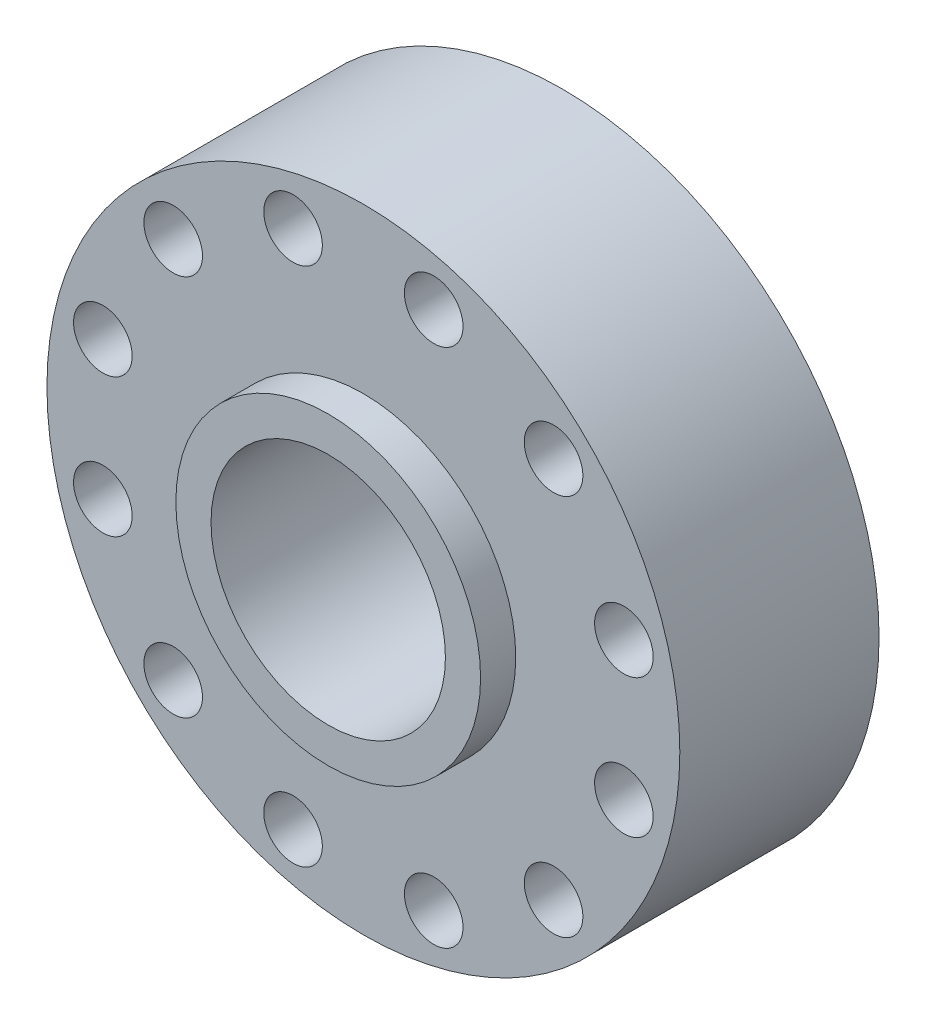
ISO-10303-21;
HEADER;
FILE_DESCRIPTION(('STEP AP214'),'2;1');
FILE_NAME('part.step','',(''),(''),'','','');
FILE_SCHEMA(('AUTOMOTIVE_DESIGN { 1 0 10303 214 1 1 1 1 }'));
ENDSEC;
DATA;
#1=APPLICATION_CONTEXT('core data for automotive mechanical design processes');
#2=APPLICATION_PROTOCOL_DEFINITION('international standard','automotive_design',2000,#1);
#3=PRODUCT_CONTEXT('',#1,'mechanical');
#4=PRODUCT('Part','Part','',(#3));
#5=PRODUCT_RELATED_PRODUCT_CATEGORY('part','',(#4));
#6=PRODUCT_DEFINITION_FORMATION('','',#4);
#7=PRODUCT_DEFINITION_CONTEXT('part definition',#1,'design');
#8=PRODUCT_DEFINITION('design','',#6,#7);
#9=PRODUCT_DEFINITION_SHAPE('','',#8);
#10=(LENGTH_UNIT() NAMED_UNIT(*) SI_UNIT(.MILLI.,.METRE.));
#11=(NAMED_UNIT(*) PLANE_ANGLE_UNIT() SI_UNIT($,.RADIAN.));
#12=(NAMED_UNIT(*) SI_UNIT($,.STERADIAN.) SOLID_ANGLE_UNIT());
#13=UNCERTAINTY_MEASURE_WITH_UNIT(LENGTH_MEASURE(1.E-05),#10,'distance_accuracy_value','');
#14=(GEOMETRIC_REPRESENTATION_CONTEXT(3) GLOBAL_UNCERTAINTY_ASSIGNED_CONTEXT((#13)) GLOBAL_UNIT_ASSIGNED_CONTEXT((#10,
#11,#12)) REPRESENTATION_CONTEXT('',''));
#15=CARTESIAN_POINT('',(0.,0.,0.));
#16=DIRECTION('',(0.,0.,1.));
#17=DIRECTION('',(1.,0.,0.));
#18=AXIS2_PLACEMENT_3D('',#15,#16,#17);
#19=CARTESIAN_POINT('',(0.,0.,8.5));
#20=DIRECTION('',(0.,0.,-1.));
#21=DIRECTION('',(-1.,0.,0.));
#22=AXIS2_PLACEMENT_3D('',#19,#20,#21);
#23=CYLINDRICAL_SURFACE('',#22,27.);
#24=CARTESIAN_POINT('',(0.,0.,8.5));
#25=DIRECTION('',(0.,0.,1.));
#26=DIRECTION('',(1.,0.,0.));
#27=AXIS2_PLACEMENT_3D('',#24,#25,#26);
#28=CIRCLE('',#27,27.);
#29=CARTESIAN_POINT('',(27.,0.,8.5));
#30=VERTEX_POINT('',#29);
#31=EDGE_CURVE('E10',#30,#30,#28,.T.);
#32=ORIENTED_EDGE('',*,*,#31,.F.);
#33=EDGE_LOOP('',(#32));
#34=FACE_BOUND('',#33,.T.);
#35=CARTESIAN_POINT('',(0.,0.,-8.5));
#36=DIRECTION('',(0.,0.,1.));
#37=DIRECTION('',(1.,0.,0.));
#38=AXIS2_PLACEMENT_3D('',#35,#36,#37);
#39=CIRCLE('',#38,27.);
#40=CARTESIAN_POINT('',(27.,0.,-8.5));
#41=VERTEX_POINT('',#40);
#42=EDGE_CURVE('E44',#41,#41,#39,.T.);
#43=ORIENTED_EDGE('',*,*,#42,.T.);
#44=EDGE_LOOP('',(#43));
#45=FACE_BOUND('',#44,.T.);
#46=ADVANCED_FACE('F41',(#34,#45),#23,.T.);
#47=CARTESIAN_POINT('',(0.,0.,8.5));
#48=DIRECTION('',(0.,0.,1.));
#49=DIRECTION('',(1.,0.,0.));
#50=AXIS2_PLACEMENT_3D('',#47,#48,#49);
#51=PLANE('',#50);
#52=CARTESIAN_POINT('',(-22.2288845230293,5.90564923288088,8.5));
#53=DIRECTION('',(0.,0.,1.));
#54=DIRECTION('',(1.,0.,0.));
#55=AXIS2_PLACEMENT_3D('',#52,#53,#54);
#56=CIRCLE('',#55,2.5);
#57=CARTESIAN_POINT('',(-19.7288845230293,5.90564923288088,8.5));
#58=VERTEX_POINT('',#57);
#59=EDGE_CURVE('E167',#58,#58,#56,.F.);
#60=ORIENTED_EDGE('',*,*,#59,.T.);
#61=EDGE_LOOP('',(#60));
#62=FACE_BOUND('',#61,.T.);
#63=CARTESIAN_POINT('',(-16.2288845230292,16.2979540782941,8.5));
#64=DIRECTION('',(0.,0.,1.));
#65=DIRECTION('',(1.,0.,0.));
#66=AXIS2_PLACEMENT_3D('',#63,#64,#65);
#67=CIRCLE('',#66,2.5);
#68=CARTESIAN_POINT('',(-13.7288845230292,16.2979540782941,8.5));
#69=VERTEX_POINT('',#68);
#70=EDGE_CURVE('E160',#69,#69,#67,.F.);
#71=ORIENTED_EDGE('',*,*,#70,.T.);
#72=EDGE_LOOP('',(#71));
#73=FACE_BOUND('',#72,.T.);
#74=CARTESIAN_POINT('',(-16.2288845230296,-16.2979540782937,8.5));
#75=DIRECTION('',(0.,0.,1.));
#76=DIRECTION('',(1.,0.,0.));
#77=AXIS2_PLACEMENT_3D('',#74,#75,#76);
#78=CIRCLE('',#77,2.5);
#79=CARTESIAN_POINT('',(-13.7288845230296,-16.2979540782937,8.5));
#80=VERTEX_POINT('',#79);
#81=EDGE_CURVE('E152',#80,#80,#78,.F.);
#82=ORIENTED_EDGE('',*,*,#81,.T.);
#83=EDGE_LOOP('',(#82));
#84=FACE_BOUND('',#83,.T.);
#85=CARTESIAN_POINT('',(-22.2288845230295,-5.90564923288042,8.5));
#86=DIRECTION('',(0.,0.,1.));
#87=DIRECTION('',(1.,0.,0.));
#88=AXIS2_PLACEMENT_3D('',#85,#86,#87);
#89=CIRCLE('',#88,2.5);
#90=CARTESIAN_POINT('',(-19.7288845230295,-5.90564923288042,8.5));
#91=VERTEX_POINT('',#90);
#92=EDGE_CURVE('E144',#91,#91,#89,.F.);
#93=ORIENTED_EDGE('',*,*,#92,.T.);
#94=EDGE_LOOP('',(#93));
#95=FACE_BOUND('',#94,.T.);
#96=CARTESIAN_POINT('',(6.00000000000001,-22.2036033111745,8.5));
#97=DIRECTION('',(0.,0.,1.));
#98=DIRECTION('',(1.,0.,0.));
#99=AXIS2_PLACEMENT_3D('',#96,#97,#98);
#100=CIRCLE('',#99,2.5);
#101=CARTESIAN_POINT('',(8.50000000000001,-22.2036033111745,8.5));
#102=VERTEX_POINT('',#101);
#103=EDGE_CURVE('E136',#102,#102,#100,.F.);
#104=ORIENTED_EDGE('',*,*,#103,.T.);
#105=EDGE_LOOP('',(#104));
#106=FACE_BOUND('',#105,.T.);
#107=CARTESIAN_POINT('',(-6.,-22.2036033111745,8.5));
#108=DIRECTION('',(0.,0.,1.));
#109=DIRECTION('',(1.,0.,0.));
#110=AXIS2_PLACEMENT_3D('',#107,#108,#109);
#111=CIRCLE('',#110,2.5);
#112=CARTESIAN_POINT('',(-3.5,-22.2036033111745,8.5));
#113=VERTEX_POINT('',#112);
#114=EDGE_CURVE('E128',#113,#113,#111,.F.);
#115=ORIENTED_EDGE('',*,*,#114,.T.);
#116=EDGE_LOOP('',(#115));
#117=FACE_BOUND('',#116,.T.);
#118=CARTESIAN_POINT('',(22.2288845230294,-5.90564923288072,8.5));
#119=DIRECTION('',(0.,0.,1.));
#120=DIRECTION('',(1.,0.,0.));
#121=AXIS2_PLACEMENT_3D('',#118,#119,#120);
#122=CIRCLE('',#121,2.5);
#123=CARTESIAN_POINT('',(24.7288845230294,-5.90564923288072,8.5));
#124=VERTEX_POINT('',#123);
#125=EDGE_CURVE('E120',#124,#124,#122,.F.);
#126=ORIENTED_EDGE('',*,*,#125,.T.);
#127=EDGE_LOOP('',(#126));
#128=FACE_BOUND('',#127,.T.);
#129=CARTESIAN_POINT('',(16.2288845230293,-16.297954078294,8.5));
#130=DIRECTION('',(0.,0.,1.));
#131=DIRECTION('',(1.,0.,0.));
#132=AXIS2_PLACEMENT_3D('',#129,#130,#131);
#133=CIRCLE('',#132,2.5);
#134=CARTESIAN_POINT('',(18.7288845230293,-16.297954078294,8.5));
#135=VERTEX_POINT('',#134);
#136=EDGE_CURVE('E112',#135,#135,#133,.F.);
#137=ORIENTED_EDGE('',*,*,#136,.T.);
#138=EDGE_LOOP('',(#137));
#139=FACE_BOUND('',#138,.T.);
#140=CARTESIAN_POINT('',(16.2288845230294,16.2979540782939,8.5));
#141=DIRECTION('',(0.,0.,1.));
#142=DIRECTION('',(1.,0.,0.));
#143=AXIS2_PLACEMENT_3D('',#140,#141,#142);
#144=CIRCLE('',#143,2.5);
#145=CARTESIAN_POINT('',(18.7288845230294,16.2979540782939,8.5));
#146=VERTEX_POINT('',#145);
#147=EDGE_CURVE('E104',#146,#146,#144,.F.);
#148=ORIENTED_EDGE('',*,*,#147,.T.);
#149=EDGE_LOOP('',(#148));
#150=FACE_BOUND('',#149,.T.);
#151=CARTESIAN_POINT('',(22.2288845230294,5.90564923288057,8.5));
#152=DIRECTION('',(0.,0.,1.));
#153=DIRECTION('',(1.,0.,0.));
#154=AXIS2_PLACEMENT_3D('',#151,#152,#153);
#155=CIRCLE('',#154,2.5);
#156=CARTESIAN_POINT('',(24.7288845230294,5.90564923288057,8.5));
#157=VERTEX_POINT('',#156);
#158=EDGE_CURVE('E96',#157,#157,#155,.F.);
#159=ORIENTED_EDGE('',*,*,#158,.T.);
#160=EDGE_LOOP('',(#159));
#161=FACE_BOUND('',#160,.T.);
#162=CARTESIAN_POINT('',(-6.00000000000001,22.2036033111745,8.5));
#163=DIRECTION('',(0.,0.,1.));
#164=DIRECTION('',(1.,0.,0.));
#165=AXIS2_PLACEMENT_3D('',#162,#163,#164);
#166=CIRCLE('',#165,2.5);
#167=CARTESIAN_POINT('',(-3.50000000000001,22.2036033111745,8.5));
#168=VERTEX_POINT('',#167);
#169=EDGE_CURVE('E88',#168,#168,#166,.F.);
#170=ORIENTED_EDGE('',*,*,#169,.T.);
#171=EDGE_LOOP('',(#170));
#172=FACE_BOUND('',#171,.T.);
#173=CARTESIAN_POINT('',(6.,22.2036033111745,8.5));
#174=DIRECTION('',(0.,0.,1.));
#175=DIRECTION('',(1.,0.,0.));
#176=AXIS2_PLACEMENT_3D('',#173,#174,#175);
#177=CIRCLE('',#176,2.5);
#178=CARTESIAN_POINT('',(8.5,22.2036033111745,8.5));
#179=VERTEX_POINT('',#178);
#180=EDGE_CURVE('E81',#179,#179,#177,.F.);
#181=ORIENTED_EDGE('',*,*,#180,.T.);
#182=EDGE_LOOP('',(#181));
#183=FACE_BOUND('',#182,.T.);
#184=CARTESIAN_POINT('',(0.,0.,8.5));
#185=DIRECTION('',(0.,0.,1.));
#186=DIRECTION('',(1.,0.,0.));
#187=AXIS2_PLACEMENT_3D('',#184,#185,#186);
#188=CIRCLE('',#187,13.);
#189=CARTESIAN_POINT('',(13.,0.,8.5));
#190=VERTEX_POINT('',#189);
#191=EDGE_CURVE('E60',#190,#190,#188,.F.);
#192=ORIENTED_EDGE('',*,*,#191,.T.);
#193=EDGE_LOOP('',(#192));
#194=FACE_BOUND('',#193,.T.);
#195=ORIENTED_EDGE('',*,*,#31,.T.);
#196=EDGE_LOOP('',(#195));
#197=FACE_BOUND('',#196,.T.);
#198=ADVANCED_FACE('F181',(#62,#73,#84,#95,#106,#117,#128,#139,#150,#161,#172,#183,#194,#197),
#51,.T.);
#199=CARTESIAN_POINT('',(0.,0.,-8.5));
#200=DIRECTION('',(0.,0.,1.));
#201=DIRECTION('',(1.,0.,0.));
#202=AXIS2_PLACEMENT_3D('',#199,#200,#201);
#203=PLANE('',#202);
#204=CARTESIAN_POINT('',(-22.2288845230293,5.90564923288088,-8.5));
#205=DIRECTION('',(0.,0.,-1.));
#206=DIRECTION('',(-0.50000000000001,-0.866025403784433,0.));
#207=AXIS2_PLACEMENT_3D('',#204,#205,#206);
#208=CIRCLE('',#207,2.5);
#209=CARTESIAN_POINT('',(-23.4788845230294,3.74058572341979,-8.5));
#210=VERTEX_POINT('',#209);
#211=EDGE_CURVE('E164',#210,#210,#208,.T.);
#212=ORIENTED_EDGE('',*,*,#211,.F.);
#213=EDGE_LOOP('',(#212));
#214=FACE_BOUND('',#213,.T.);
#215=CARTESIAN_POINT('',(-16.2288845230292,16.2979540782941,-8.5));
#216=DIRECTION('',(0.,0.,-1.));
#217=DIRECTION('',(-0.50000000000001,-0.866025403784433,0.));
#218=AXIS2_PLACEMENT_3D('',#215,#216,#217);
#219=CIRCLE('',#218,2.5);
#220=CARTESIAN_POINT('',(-17.4788845230292,14.132890568833,-8.5));
#221=VERTEX_POINT('',#220);
#222=EDGE_CURVE('E156',#221,#221,#219,.T.);
#223=ORIENTED_EDGE('',*,*,#222,.F.);
#224=EDGE_LOOP('',(#223));
#225=FACE_BOUND('',#224,.T.);
#226=CARTESIAN_POINT('',(-16.2288845230296,-16.2979540782937,-8.5));
#227=DIRECTION('',(0.,0.,-1.));
#228=DIRECTION('',(0.499999999999992,-0.866025403784443,0.));
#229=AXIS2_PLACEMENT_3D('',#226,#227,#228);
#230=CIRCLE('',#229,2.5);
#231=CARTESIAN_POINT('',(-14.9788845230296,-18.4630175877549,-8.5));
#232=VERTEX_POINT('',#231);
#233=EDGE_CURVE('E148',#232,#232,#230,.T.);
#234=ORIENTED_EDGE('',*,*,#233,.F.);
#235=EDGE_LOOP('',(#234));
#236=FACE_BOUND('',#235,.T.);
#237=CARTESIAN_POINT('',(-22.2288845230295,-5.90564923288042,-8.5));
#238=DIRECTION('',(0.,0.,-1.));
#239=DIRECTION('',(0.499999999999992,-0.866025403784443,0.));
#240=AXIS2_PLACEMENT_3D('',#237,#238,#239);
#241=CIRCLE('',#240,2.5);
#242=CARTESIAN_POINT('',(-20.9788845230295,-8.07071274234153,-8.5));
#243=VERTEX_POINT('',#242);
#244=EDGE_CURVE('E140',#243,#243,#241,.T.);
#245=ORIENTED_EDGE('',*,*,#244,.F.);
#246=EDGE_LOOP('',(#245));
#247=FACE_BOUND('',#246,.T.);
#248=CARTESIAN_POINT('',(6.00000000000001,-22.2036033111745,-8.5));
#249=DIRECTION('',(0.,0.,-1.));
#250=DIRECTION('',(1.,0.,0.));
#251=AXIS2_PLACEMENT_3D('',#248,#249,#250);
#252=CIRCLE('',#251,2.5);
#253=CARTESIAN_POINT('',(8.50000000000001,-22.2036033111745,-8.5));
#254=VERTEX_POINT('',#253);
#255=EDGE_CURVE('E132',#254,#254,#252,.T.);
#256=ORIENTED_EDGE('',*,*,#255,.F.);
#257=EDGE_LOOP('',(#256));
#258=FACE_BOUND('',#257,.T.);
#259=CARTESIAN_POINT('',(-6.,-22.2036033111745,-8.5));
#260=DIRECTION('',(0.,0.,-1.));
#261=DIRECTION('',(1.,0.,0.));
#262=AXIS2_PLACEMENT_3D('',#259,#260,#261);
#263=CIRCLE('',#262,2.5);
#264=CARTESIAN_POINT('',(-3.5,-22.2036033111745,-8.5));
#265=VERTEX_POINT('',#264);
#266=EDGE_CURVE('E124',#265,#265,#263,.T.);
#267=ORIENTED_EDGE('',*,*,#266,.F.);
#268=EDGE_LOOP('',(#267));
#269=FACE_BOUND('',#268,.T.);
#270=CARTESIAN_POINT('',(22.2288845230294,-5.90564923288072,-8.5));
#271=DIRECTION('',(0.,0.,-1.));
#272=DIRECTION('',(0.500000000000004,0.866025403784436,0.));
#273=AXIS2_PLACEMENT_3D('',#270,#271,#272);
#274=CIRCLE('',#273,2.5);
#275=CARTESIAN_POINT('',(23.4788845230294,-3.74058572341963,-8.5));
#276=VERTEX_POINT('',#275);
#277=EDGE_CURVE('E116',#276,#276,#274,.T.);
#278=ORIENTED_EDGE('',*,*,#277,.F.);
#279=EDGE_LOOP('',(#278));
#280=FACE_BOUND('',#279,.T.);
#281=CARTESIAN_POINT('',(16.2288845230293,-16.297954078294,-8.5));
#282=DIRECTION('',(0.,0.,-1.));
#283=DIRECTION('',(0.500000000000004,0.866025403784436,0.));
#284=AXIS2_PLACEMENT_3D('',#281,#282,#283);
#285=CIRCLE('',#284,2.5);
#286=CARTESIAN_POINT('',(17.4788845230294,-14.1328905688329,-8.5));
#287=VERTEX_POINT('',#286);
#288=EDGE_CURVE('E108',#287,#287,#285,.T.);
#289=ORIENTED_EDGE('',*,*,#288,.F.);
#290=EDGE_LOOP('',(#289));
#291=FACE_BOUND('',#290,.T.);
#292=CARTESIAN_POINT('',(16.2288845230294,16.2979540782939,-8.5));
#293=DIRECTION('',(0.,0.,-1.));
#294=DIRECTION('',(-0.499999999999998,0.86602540378444,0.));
#295=AXIS2_PLACEMENT_3D('',#292,#293,#294);
#296=CIRCLE('',#295,2.5);
#297=CARTESIAN_POINT('',(14.9788845230294,18.463017587755,-8.5));
#298=VERTEX_POINT('',#297);
#299=EDGE_CURVE('E100',#298,#298,#296,.T.);
#300=ORIENTED_EDGE('',*,*,#299,.F.);
#301=EDGE_LOOP('',(#300));
#302=FACE_BOUND('',#301,.T.);
#303=CARTESIAN_POINT('',(22.2288845230294,5.90564923288057,-8.5));
#304=DIRECTION('',(0.,0.,-1.));
#305=DIRECTION('',(-0.499999999999998,0.86602540378444,0.));
#306=AXIS2_PLACEMENT_3D('',#303,#304,#305);
#307=CIRCLE('',#306,2.5);
#308=CARTESIAN_POINT('',(20.9788845230294,8.07071274234167,-8.5));
#309=VERTEX_POINT('',#308);
#310=EDGE_CURVE('E92',#309,#309,#307,.T.);
#311=ORIENTED_EDGE('',*,*,#310,.F.);
#312=EDGE_LOOP('',(#311));
#313=FACE_BOUND('',#312,.T.);
#314=CARTESIAN_POINT('',(-6.00000000000001,22.2036033111745,-8.5));
#315=DIRECTION('',(0.,0.,-1.));
#316=DIRECTION('',(-1.,0.,0.));
#317=AXIS2_PLACEMENT_3D('',#314,#315,#316);
#318=CIRCLE('',#317,2.5);
#319=CARTESIAN_POINT('',(-8.50000000000001,22.2036033111745,-8.5));
#320=VERTEX_POINT('',#319);
#321=EDGE_CURVE('E85',#320,#320,#318,.T.);
#322=ORIENTED_EDGE('',*,*,#321,.F.);
#323=EDGE_LOOP('',(#322));
#324=FACE_BOUND('',#323,.T.);
#325=CARTESIAN_POINT('',(6.,22.2036033111745,-8.5));
#326=DIRECTION('',(0.,0.,-1.));
#327=DIRECTION('',(-1.,0.,0.));
#328=AXIS2_PLACEMENT_3D('',#325,#326,#327);
#329=CIRCLE('',#328,2.5);
#330=CARTESIAN_POINT('',(3.5,22.2036033111745,-8.5));
#331=VERTEX_POINT('',#330);
#332=EDGE_CURVE('E77',#331,#331,#329,.T.);
#333=ORIENTED_EDGE('',*,*,#332,.F.);
#334=EDGE_LOOP('',(#333));
#335=FACE_BOUND('',#334,.T.);
#336=CARTESIAN_POINT('',(0.,0.,-8.5));
#337=DIRECTION('',(0.,0.,-1.));
#338=DIRECTION('',(-1.,0.,0.));
#339=AXIS2_PLACEMENT_3D('',#336,#337,#338);
#340=CIRCLE('',#339,13.);
#341=CARTESIAN_POINT('',(-13.,0.,-8.5));
#342=VERTEX_POINT('',#341);
#343=EDGE_CURVE('E55',#342,#342,#340,.T.);
#344=ORIENTED_EDGE('',*,*,#343,.F.);
#345=EDGE_LOOP('',(#344));
#346=FACE_BOUND('',#345,.T.);
#347=ORIENTED_EDGE('',*,*,#42,.F.);
#348=EDGE_LOOP('',(#347));
#349=FACE_BOUND('',#348,.T.);
#350=ADVANCED_FACE('F177',(#214,#225,#236,#247,#258,#269,#280,#291,#302,#313,#324,#335,#346,
#349),#203,.F.);
#351=CARTESIAN_POINT('',(0.,0.,11.5));
#352=DIRECTION('',(0.,0.,-1.));
#353=DIRECTION('',(-1.,0.,0.));
#354=AXIS2_PLACEMENT_3D('',#351,#352,#353);
#355=CYLINDRICAL_SURFACE('',#354,13.);
#356=CARTESIAN_POINT('',(0.,0.,-11.5));
#357=DIRECTION('',(0.,0.,1.));
#358=DIRECTION('',(1.,0.,0.));
#359=AXIS2_PLACEMENT_3D('',#356,#357,#358);
#360=CIRCLE('',#359,13.);
#361=CARTESIAN_POINT('',(13.,0.,-11.5));
#362=VERTEX_POINT('',#361);
#363=EDGE_CURVE('E65',#362,#362,#360,.T.);
#364=ORIENTED_EDGE('',*,*,#363,.T.);
#365=EDGE_LOOP('',(#364));
#366=FACE_BOUND('',#365,.T.);
#367=ORIENTED_EDGE('',*,*,#343,.T.);
#368=EDGE_LOOP('',(#367));
#369=FACE_BOUND('',#368,.T.);
#370=ADVANCED_FACE('F180',(#366,#369),#355,.T.);
#371=CARTESIAN_POINT('',(0.,0.,11.5));
#372=DIRECTION('',(0.,0.,1.));
#373=DIRECTION('',(1.,0.,0.));
#374=AXIS2_PLACEMENT_3D('',#371,#372,#373);
#375=PLANE('',#374);
#376=CARTESIAN_POINT('',(0.,0.,11.5));
#377=DIRECTION('',(0.,0.,1.));
#378=DIRECTION('',(1.,0.,0.));
#379=AXIS2_PLACEMENT_3D('',#376,#377,#378);
#380=CIRCLE('',#379,13.);
#381=CARTESIAN_POINT('',(13.,0.,11.5));
#382=VERTEX_POINT('',#381);
#383=EDGE_CURVE('E64',#382,#382,#380,.T.);
#384=ORIENTED_EDGE('',*,*,#383,.T.);
#385=EDGE_LOOP('',(#384));
#386=FACE_BOUND('',#385,.T.);
#387=CARTESIAN_POINT('',(0.,0.,11.5));
#388=DIRECTION('',(0.,0.,1.));
#389=DIRECTION('',(1.,0.,0.));
#390=AXIS2_PLACEMENT_3D('',#387,#388,#389);
#391=CIRCLE('',#390,10.);
#392=CARTESIAN_POINT('',(10.,0.,11.5));
#393=VERTEX_POINT('',#392);
#394=EDGE_CURVE('E69',#393,#393,#391,.T.);
#395=ORIENTED_EDGE('',*,*,#394,.F.);
#396=EDGE_LOOP('',(#395));
#397=FACE_BOUND('',#396,.T.);
#398=ADVANCED_FACE('F227',(#386,#397),#375,.T.);
#399=CARTESIAN_POINT('',(0.,0.,-11.5));
#400=DIRECTION('',(0.,0.,1.));
#401=DIRECTION('',(1.,0.,0.));
#402=AXIS2_PLACEMENT_3D('',#399,#400,#401);
#403=PLANE('',#402);
#404=ORIENTED_EDGE('',*,*,#363,.F.);
#405=EDGE_LOOP('',(#404));
#406=FACE_BOUND('',#405,.T.);
#407=CARTESIAN_POINT('',(0.,0.,-11.5));
#408=DIRECTION('',(0.,0.,1.));
#409=DIRECTION('',(1.,0.,0.));
#410=AXIS2_PLACEMENT_3D('',#407,#408,#409);
#411=CIRCLE('',#410,10.);
#412=CARTESIAN_POINT('',(10.,0.,-11.5));
#413=VERTEX_POINT('',#412);
#414=EDGE_CURVE('E73',#413,#413,#411,.T.);
#415=ORIENTED_EDGE('',*,*,#414,.T.);
#416=EDGE_LOOP('',(#415));
#417=FACE_BOUND('',#416,.T.);
#418=ADVANCED_FACE('F223',(#406,#417),#403,.F.);
#419=ORIENTED_EDGE('',*,*,#191,.F.);
#420=EDGE_LOOP('',(#419));
#421=FACE_BOUND('',#420,.T.);
#422=ORIENTED_EDGE('',*,*,#383,.F.);
#423=EDGE_LOOP('',(#422));
#424=FACE_BOUND('',#423,.T.);
#425=ADVANCED_FACE('F219',(#421,#424),#355,.T.);
#426=CARTESIAN_POINT('',(0.,0.,11.5));
#427=DIRECTION('',(0.,0.,-1.));
#428=DIRECTION('',(-1.,0.,0.));
#429=AXIS2_PLACEMENT_3D('',#426,#427,#428);
#430=CYLINDRICAL_SURFACE('',#429,10.);
#431=ORIENTED_EDGE('',*,*,#394,.T.);
#432=EDGE_LOOP('',(#431));
#433=FACE_BOUND('',#432,.T.);
#434=ORIENTED_EDGE('',*,*,#414,.F.);
#435=EDGE_LOOP('',(#434));
#436=FACE_BOUND('',#435,.T.);
#437=ADVANCED_FACE('F222',(#433,#436),#430,.F.);
#438=CARTESIAN_POINT('',(6.,22.2036033111745,11.501));
#439=DIRECTION('',(0.,0.,-1.));
#440=DIRECTION('',(-1.,0.,0.));
#441=AXIS2_PLACEMENT_3D('',#438,#439,#440);
#442=CYLINDRICAL_SURFACE('',#441,2.5);
#443=ORIENTED_EDGE('',*,*,#180,.F.);
#444=EDGE_LOOP('',(#443));
#445=FACE_BOUND('',#444,.T.);
#446=ORIENTED_EDGE('',*,*,#332,.T.);
#447=EDGE_LOOP('',(#446));
#448=FACE_BOUND('',#447,.T.);
#449=ADVANCED_FACE('F234',(#445,#448),#442,.F.);
#450=CARTESIAN_POINT('',(-6.00000000000001,22.2036033111745,11.501));
#451=DIRECTION('',(0.,0.,-1.));
#452=DIRECTION('',(-1.,0.,0.));
#453=AXIS2_PLACEMENT_3D('',#450,#451,#452);
#454=CYLINDRICAL_SURFACE('',#453,2.5);
#455=ORIENTED_EDGE('',*,*,#169,.F.);
#456=EDGE_LOOP('',(#455));
#457=FACE_BOUND('',#456,.T.);
#458=ORIENTED_EDGE('',*,*,#321,.T.);
#459=EDGE_LOOP('',(#458));
#460=FACE_BOUND('',#459,.T.);
#461=ADVANCED_FACE('F238',(#457,#460),#454,.F.);
#462=CARTESIAN_POINT('',(22.2288845230294,5.90564923288057,11.501));
#463=DIRECTION('',(0.,0.,-1.));
#464=DIRECTION('',(-1.,0.,0.));
#465=AXIS2_PLACEMENT_3D('',#462,#463,#464);
#466=CYLINDRICAL_SURFACE('',#465,2.5);
#467=ORIENTED_EDGE('',*,*,#158,.F.);
#468=EDGE_LOOP('',(#467));
#469=FACE_BOUND('',#468,.T.);
#470=ORIENTED_EDGE('',*,*,#310,.T.);
#471=EDGE_LOOP('',(#470));
#472=FACE_BOUND('',#471,.T.);
#473=ADVANCED_FACE('F242',(#469,#472),#466,.F.);
#474=CARTESIAN_POINT('',(16.2288845230294,16.2979540782939,11.501));
#475=DIRECTION('',(0.,0.,-1.));
#476=DIRECTION('',(-1.,0.,0.));
#477=AXIS2_PLACEMENT_3D('',#474,#475,#476);
#478=CYLINDRICAL_SURFACE('',#477,2.5);
#479=ORIENTED_EDGE('',*,*,#147,.F.);
#480=EDGE_LOOP('',(#479));
#481=FACE_BOUND('',#480,.T.);
#482=ORIENTED_EDGE('',*,*,#299,.T.);
#483=EDGE_LOOP('',(#482));
#484=FACE_BOUND('',#483,.T.);
#485=ADVANCED_FACE('F246',(#481,#484),#478,.F.);
#486=CARTESIAN_POINT('',(16.2288845230293,-16.297954078294,11.501));
#487=DIRECTION('',(0.,0.,-1.));
#488=DIRECTION('',(-1.,0.,0.));
#489=AXIS2_PLACEMENT_3D('',#486,#487,#488);
#490=CYLINDRICAL_SURFACE('',#489,2.5);
#491=ORIENTED_EDGE('',*,*,#136,.F.);
#492=EDGE_LOOP('',(#491));
#493=FACE_BOUND('',#492,.T.);
#494=ORIENTED_EDGE('',*,*,#288,.T.);
#495=EDGE_LOOP('',(#494));
#496=FACE_BOUND('',#495,.T.);
#497=ADVANCED_FACE('F250',(#493,#496),#490,.F.);
#498=CARTESIAN_POINT('',(22.2288845230294,-5.90564923288072,11.501));
#499=DIRECTION('',(0.,0.,-1.));
#500=DIRECTION('',(-1.,0.,0.));
#501=AXIS2_PLACEMENT_3D('',#498,#499,#500);
#502=CYLINDRICAL_SURFACE('',#501,2.5);
#503=ORIENTED_EDGE('',*,*,#125,.F.);
#504=EDGE_LOOP('',(#503));
#505=FACE_BOUND('',#504,.T.);
#506=ORIENTED_EDGE('',*,*,#277,.T.);
#507=EDGE_LOOP('',(#506));
#508=FACE_BOUND('',#507,.T.);
#509=ADVANCED_FACE('F254',(#505,#508),#502,.F.);
#510=CARTESIAN_POINT('',(-6.,-22.2036033111745,11.501));
#511=DIRECTION('',(0.,0.,-1.));
#512=DIRECTION('',(-1.,0.,0.));
#513=AXIS2_PLACEMENT_3D('',#510,#511,#512);
#514=CYLINDRICAL_SURFACE('',#513,2.5);
#515=ORIENTED_EDGE('',*,*,#114,.F.);
#516=EDGE_LOOP('',(#515));
#517=FACE_BOUND('',#516,.T.);
#518=ORIENTED_EDGE('',*,*,#266,.T.);
#519=EDGE_LOOP('',(#518));
#520=FACE_BOUND('',#519,.T.);
#521=ADVANCED_FACE('F258',(#517,#520),#514,.F.);
#522=CARTESIAN_POINT('',(6.00000000000001,-22.2036033111745,11.501));
#523=DIRECTION('',(0.,0.,-1.));
#524=DIRECTION('',(-1.,0.,0.));
#525=AXIS2_PLACEMENT_3D('',#522,#523,#524);
#526=CYLINDRICAL_SURFACE('',#525,2.5);
#527=ORIENTED_EDGE('',*,*,#103,.F.);
#528=EDGE_LOOP('',(#527));
#529=FACE_BOUND('',#528,.T.);
#530=ORIENTED_EDGE('',*,*,#255,.T.);
#531=EDGE_LOOP('',(#530));
#532=FACE_BOUND('',#531,.T.);
#533=ADVANCED_FACE('F262',(#529,#532),#526,.F.);
#534=CARTESIAN_POINT('',(-22.2288845230295,-5.90564923288042,11.501));
#535=DIRECTION('',(0.,0.,-1.));
#536=DIRECTION('',(-1.,0.,0.));
#537=AXIS2_PLACEMENT_3D('',#534,#535,#536);
#538=CYLINDRICAL_SURFACE('',#537,2.5);
#539=ORIENTED_EDGE('',*,*,#92,.F.);
#540=EDGE_LOOP('',(#539));
#541=FACE_BOUND('',#540,.T.);
#542=ORIENTED_EDGE('',*,*,#244,.T.);
#543=EDGE_LOOP('',(#542));
#544=FACE_BOUND('',#543,.T.);
#545=ADVANCED_FACE('F266',(#541,#544),#538,.F.);
#546=CARTESIAN_POINT('',(-16.2288845230296,-16.2979540782937,11.501));
#547=DIRECTION('',(0.,0.,-1.));
#548=DIRECTION('',(-1.,0.,0.));
#549=AXIS2_PLACEMENT_3D('',#546,#547,#548);
#550=CYLINDRICAL_SURFACE('',#549,2.5);
#551=ORIENTED_EDGE('',*,*,#81,.F.);
#552=EDGE_LOOP('',(#551));
#553=FACE_BOUND('',#552,.T.);
#554=ORIENTED_EDGE('',*,*,#233,.T.);
#555=EDGE_LOOP('',(#554));
#556=FACE_BOUND('',#555,.T.);
#557=ADVANCED_FACE('F270',(#553,#556),#550,.F.);
#558=CARTESIAN_POINT('',(-16.2288845230292,16.2979540782941,11.501));
#559=DIRECTION('',(0.,0.,-1.));
#560=DIRECTION('',(-1.,0.,0.));
#561=AXIS2_PLACEMENT_3D('',#558,#559,#560);
#562=CYLINDRICAL_SURFACE('',#561,2.5);
#563=ORIENTED_EDGE('',*,*,#70,.F.);
#564=EDGE_LOOP('',(#563));
#565=FACE_BOUND('',#564,.T.);
#566=ORIENTED_EDGE('',*,*,#222,.T.);
#567=EDGE_LOOP('',(#566));
#568=FACE_BOUND('',#567,.T.);
#569=ADVANCED_FACE('F274',(#565,#568),#562,.F.);
#570=CARTESIAN_POINT('',(-22.2288845230293,5.90564923288088,11.501));
#571=DIRECTION('',(0.,0.,-1.));
#572=DIRECTION('',(-1.,0.,0.));
#573=AXIS2_PLACEMENT_3D('',#570,#571,#572);
#574=CYLINDRICAL_SURFACE('',#573,2.5);
#575=ORIENTED_EDGE('',*,*,#59,.F.);
#576=EDGE_LOOP('',(#575));
#577=FACE_BOUND('',#576,.T.);
#578=ORIENTED_EDGE('',*,*,#211,.T.);
#579=EDGE_LOOP('',(#578));
#580=FACE_BOUND('',#579,.T.);
#581=ADVANCED_FACE('F175',(#577,#580),#574,.F.);
#582=CLOSED_SHELL('',(#46,#198,#350,#370,#398,#418,#425,#437,#449,#461,#473,#485,#497,#509,#521,
#533,#545,#557,#569,#581));
#583=MANIFOLD_SOLID_BREP('B2',#582);
#584=ADVANCED_BREP_SHAPE_REPRESENTATION('',(#18,#583),#14);
#585=SHAPE_DEFINITION_REPRESENTATION(#9,#584);
ENDSEC;
END-ISO-10303-21;
